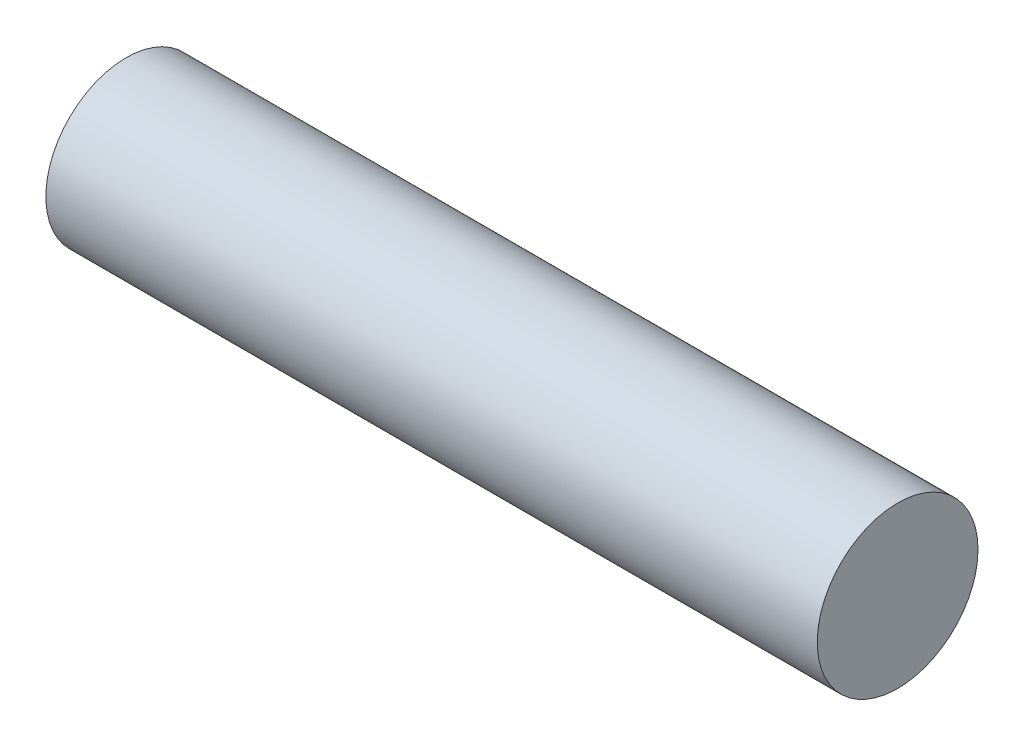
ISO-10303-21;
HEADER;
FILE_DESCRIPTION(('STEP AP214'),'2;1');
FILE_NAME('part.step','',(''),(''),'','','');
FILE_SCHEMA(('AUTOMOTIVE_DESIGN { 1 0 10303 214 1 1 1 1 }'));
ENDSEC;
DATA;
#1=APPLICATION_CONTEXT('core data for automotive mechanical design processes');
#2=APPLICATION_PROTOCOL_DEFINITION('international standard','automotive_design',2000,#1);
#3=PRODUCT_CONTEXT('',#1,'mechanical');
#4=PRODUCT('Part','Part','',(#3));
#5=PRODUCT_RELATED_PRODUCT_CATEGORY('part','',(#4));
#6=PRODUCT_DEFINITION_FORMATION('','',#4);
#7=PRODUCT_DEFINITION_CONTEXT('part definition',#1,'design');
#8=PRODUCT_DEFINITION('design','',#6,#7);
#9=PRODUCT_DEFINITION_SHAPE('','',#8);
#10=(LENGTH_UNIT() NAMED_UNIT(*) SI_UNIT(.MILLI.,.METRE.));
#11=(NAMED_UNIT(*) PLANE_ANGLE_UNIT() SI_UNIT($,.RADIAN.));
#12=(NAMED_UNIT(*) SI_UNIT($,.STERADIAN.) SOLID_ANGLE_UNIT());
#13=UNCERTAINTY_MEASURE_WITH_UNIT(LENGTH_MEASURE(1.E-05),#10,'distance_accuracy_value','');
#14=(GEOMETRIC_REPRESENTATION_CONTEXT(3) GLOBAL_UNCERTAINTY_ASSIGNED_CONTEXT((#13)) GLOBAL_UNIT_ASSIGNED_CONTEXT((#10,
#11,#12)) REPRESENTATION_CONTEXT('',''));
#15=CARTESIAN_POINT('',(0.,0.,0.));
#16=DIRECTION('',(0.,0.,1.));
#17=DIRECTION('',(1.,0.,0.));
#18=AXIS2_PLACEMENT_3D('',#15,#16,#17);
#19=CARTESIAN_POINT('',(120.,0.,0.));
#20=DIRECTION('',(-1.,0.,0.));
#21=DIRECTION('',(0.,0.,1.));
#22=AXIS2_PLACEMENT_3D('',#19,#20,#21);
#23=CYLINDRICAL_SURFACE('',#22,12.5);
#24=CARTESIAN_POINT('',(120.,0.,0.));
#25=DIRECTION('',(1.,0.,0.));
#26=DIRECTION('',(0.,0.,-1.));
#27=AXIS2_PLACEMENT_3D('',#24,#25,#26);
#28=CIRCLE('',#27,12.5);
#29=CARTESIAN_POINT('',(120.,0.,-12.5));
#30=VERTEX_POINT('',#29);
#31=EDGE_CURVE('E10',#30,#30,#28,.T.);
#32=ORIENTED_EDGE('',*,*,#31,.F.);
#33=EDGE_LOOP('',(#32));
#34=FACE_BOUND('',#33,.T.);
#35=CARTESIAN_POINT('',(0.,0.,0.));
#36=DIRECTION('',(1.,0.,0.));
#37=DIRECTION('',(0.,0.,-1.));
#38=AXIS2_PLACEMENT_3D('',#35,#36,#37);
#39=CIRCLE('',#38,12.5);
#40=CARTESIAN_POINT('',(0.,0.,-12.5));
#41=VERTEX_POINT('',#40);
#42=EDGE_CURVE('E34',#41,#41,#39,.T.);
#43=ORIENTED_EDGE('',*,*,#42,.T.);
#44=EDGE_LOOP('',(#43));
#45=FACE_BOUND('',#44,.T.);
#46=ADVANCED_FACE('F31',(#34,#45),#23,.T.);
#47=CARTESIAN_POINT('',(120.,0.,0.));
#48=DIRECTION('',(1.,0.,0.));
#49=DIRECTION('',(0.,0.,-1.));
#50=AXIS2_PLACEMENT_3D('',#47,#48,#49);
#51=PLANE('',#50);
#52=ORIENTED_EDGE('',*,*,#31,.T.);
#53=EDGE_LOOP('',(#52));
#54=FACE_BOUND('',#53,.T.);
#55=ADVANCED_FACE('F46',(#54),#51,.T.);
#56=CARTESIAN_POINT('',(0.,0.,0.));
#57=DIRECTION('',(1.,0.,0.));
#58=DIRECTION('',(0.,0.,-1.));
#59=AXIS2_PLACEMENT_3D('',#56,#57,#58);
#60=PLANE('',#59);
#61=ORIENTED_EDGE('',*,*,#42,.F.);
#62=EDGE_LOOP('',(#61));
#63=FACE_BOUND('',#62,.T.);
#64=ADVANCED_FACE('F44',(#63),#60,.F.);
#65=CLOSED_SHELL('',(#46,#55,#64));
#66=MANIFOLD_SOLID_BREP('B2',#65);
#67=ADVANCED_BREP_SHAPE_REPRESENTATION('',(#18,#66),#14);
#68=SHAPE_DEFINITION_REPRESENTATION(#9,#67);
ENDSEC;
END-ISO-10303-21;
